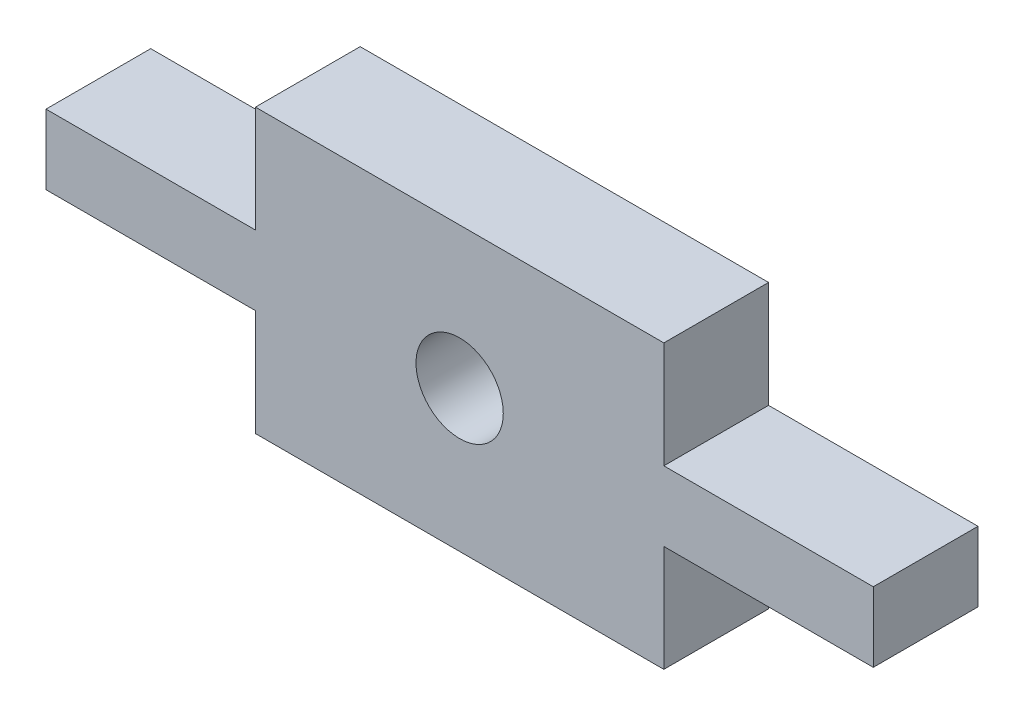
ISO-10303-21;
HEADER;
FILE_DESCRIPTION(('STEP AP214'),'2;1');
FILE_NAME('part.step','',(''),(''),'','','');
FILE_SCHEMA(('AUTOMOTIVE_DESIGN { 1 0 10303 214 1 1 1 1 }'));
ENDSEC;
DATA;
#1=APPLICATION_CONTEXT('core data for automotive mechanical design processes');
#2=APPLICATION_PROTOCOL_DEFINITION('international standard','automotive_design',2000,#1);
#3=PRODUCT_CONTEXT('',#1,'mechanical');
#4=PRODUCT('Part','Part','',(#3));
#5=PRODUCT_RELATED_PRODUCT_CATEGORY('part','',(#4));
#6=PRODUCT_DEFINITION_FORMATION('','',#4);
#7=PRODUCT_DEFINITION_CONTEXT('part definition',#1,'design');
#8=PRODUCT_DEFINITION('design','',#6,#7);
#9=PRODUCT_DEFINITION_SHAPE('','',#8);
#10=(LENGTH_UNIT() NAMED_UNIT(*) SI_UNIT(.MILLI.,.METRE.));
#11=(NAMED_UNIT(*) PLANE_ANGLE_UNIT() SI_UNIT($,.RADIAN.));
#12=(NAMED_UNIT(*) SI_UNIT($,.STERADIAN.) SOLID_ANGLE_UNIT());
#13=UNCERTAINTY_MEASURE_WITH_UNIT(LENGTH_MEASURE(1.E-05),#10,'distance_accuracy_value','');
#14=(GEOMETRIC_REPRESENTATION_CONTEXT(3) GLOBAL_UNCERTAINTY_ASSIGNED_CONTEXT((#13)) GLOBAL_UNIT_ASSIGNED_CONTEXT((#10,
#11,#12)) REPRESENTATION_CONTEXT('',''));
#15=CARTESIAN_POINT('',(0.,0.,0.));
#16=DIRECTION('',(0.,0.,1.));
#17=DIRECTION('',(1.,0.,0.));
#18=AXIS2_PLACEMENT_3D('',#15,#16,#17);
#19=CARTESIAN_POINT('',(0.,3.05,-3.));
#20=DIRECTION('',(-1.,0.,0.));
#21=DIRECTION('',(0.,0.,1.));
#22=AXIS2_PLACEMENT_3D('',#19,#20,#21);
#23=PLANE('',#22);
#24=DIRECTION('',(0.,-1.,0.));
#25=VECTOR('',#24,1.);
#26=CARTESIAN_POINT('',(0.,3.05,0.));
#27=LINE('',#26,#25);
#28=CARTESIAN_POINT('',(0.,3.05,0.));
#29=VERTEX_POINT('',#28);
#30=CARTESIAN_POINT('',(0.,0.,0.));
#31=VERTEX_POINT('',#30);
#32=EDGE_CURVE('E157',#29,#31,#27,.T.);
#33=ORIENTED_EDGE('',*,*,#32,.F.);
#34=DIRECTION('',(0.,0.,1.));
#35=VECTOR('',#34,1.);
#36=CARTESIAN_POINT('',(0.,3.05,-3.));
#37=LINE('',#36,#35);
#38=CARTESIAN_POINT('',(0.,3.05,-3.));
#39=VERTEX_POINT('',#38);
#40=EDGE_CURVE('E11',#39,#29,#37,.T.);
#41=ORIENTED_EDGE('',*,*,#40,.F.);
#42=DIRECTION('',(0.,-1.,0.));
#43=VECTOR('',#42,1.);
#44=CARTESIAN_POINT('',(0.,3.05,-3.));
#45=LINE('',#44,#43);
#46=CARTESIAN_POINT('',(0.,0.,-3.));
#47=VERTEX_POINT('',#46);
#48=EDGE_CURVE('E190',#39,#47,#45,.T.);
#49=ORIENTED_EDGE('',*,*,#48,.T.);
#50=DIRECTION('',(0.,0.,1.));
#51=VECTOR('',#50,1.);
#52=CARTESIAN_POINT('',(0.,0.,-3.));
#53=LINE('',#52,#51);
#54=EDGE_CURVE('E39',#47,#31,#53,.T.);
#55=ORIENTED_EDGE('',*,*,#54,.T.);
#56=EDGE_LOOP('',(#33,#41,#49,#55));
#57=FACE_BOUND('',#56,.T.);
#58=ADVANCED_FACE('F36',(#57),#23,.T.);
#59=CARTESIAN_POINT('',(-6.,3.05,-3.));
#60=DIRECTION('',(0.,-1.,0.));
#61=DIRECTION('',(1.,0.,0.));
#62=AXIS2_PLACEMENT_3D('',#59,#60,#61);
#63=PLANE('',#62);
#64=DIRECTION('',(1.,0.,0.));
#65=VECTOR('',#64,1.);
#66=CARTESIAN_POINT('',(-6.,3.05,0.));
#67=LINE('',#66,#65);
#68=CARTESIAN_POINT('',(-6.,3.05,0.));
#69=VERTEX_POINT('',#68);
#70=EDGE_CURVE('E188',#69,#29,#67,.T.);
#71=ORIENTED_EDGE('',*,*,#70,.F.);
#72=DIRECTION('',(0.,0.,1.));
#73=VECTOR('',#72,1.);
#74=CARTESIAN_POINT('',(-6.,3.05,-3.));
#75=LINE('',#74,#73);
#76=CARTESIAN_POINT('',(-6.,3.05,-3.));
#77=VERTEX_POINT('',#76);
#78=EDGE_CURVE('E45',#77,#69,#75,.T.);
#79=ORIENTED_EDGE('',*,*,#78,.F.);
#80=DIRECTION('',(1.,0.,0.));
#81=VECTOR('',#80,1.);
#82=CARTESIAN_POINT('',(-6.,3.05,-3.));
#83=LINE('',#82,#81);
#84=EDGE_CURVE('E147',#77,#39,#83,.T.);
#85=ORIENTED_EDGE('',*,*,#84,.T.);
#86=ORIENTED_EDGE('',*,*,#40,.T.);
#87=EDGE_LOOP('',(#71,#79,#85,#86));
#88=FACE_BOUND('',#87,.T.);
#89=ADVANCED_FACE('F210',(#88),#63,.T.);
#90=CARTESIAN_POINT('',(-6.,5.05,-3.));
#91=DIRECTION('',(-1.,0.,0.));
#92=DIRECTION('',(0.,0.,1.));
#93=AXIS2_PLACEMENT_3D('',#90,#91,#92);
#94=PLANE('',#93);
#95=DIRECTION('',(0.,-1.,0.));
#96=VECTOR('',#95,1.);
#97=CARTESIAN_POINT('',(-6.,5.05,0.));
#98=LINE('',#97,#96);
#99=CARTESIAN_POINT('',(-6.,5.05,0.));
#100=VERTEX_POINT('',#99);
#101=EDGE_CURVE('E134',#100,#69,#98,.T.);
#102=ORIENTED_EDGE('',*,*,#101,.F.);
#103=DIRECTION('',(0.,0.,1.));
#104=VECTOR('',#103,1.);
#105=CARTESIAN_POINT('',(-6.,5.05,-3.));
#106=LINE('',#105,#104);
#107=CARTESIAN_POINT('',(-6.,5.05,-3.));
#108=VERTEX_POINT('',#107);
#109=EDGE_CURVE('E129',#108,#100,#106,.T.);
#110=ORIENTED_EDGE('',*,*,#109,.F.);
#111=DIRECTION('',(0.,-1.,0.));
#112=VECTOR('',#111,1.);
#113=CARTESIAN_POINT('',(-6.,5.05,-3.));
#114=LINE('',#113,#112);
#115=EDGE_CURVE('E132',#108,#77,#114,.T.);
#116=ORIENTED_EDGE('',*,*,#115,.T.);
#117=ORIENTED_EDGE('',*,*,#78,.T.);
#118=EDGE_LOOP('',(#102,#110,#116,#117));
#119=FACE_BOUND('',#118,.T.);
#120=ADVANCED_FACE('F131',(#119),#94,.T.);
#121=CARTESIAN_POINT('',(0.,5.05,-3.));
#122=DIRECTION('',(0.,1.,0.));
#123=DIRECTION('',(0.,0.,1.));
#124=AXIS2_PLACEMENT_3D('',#121,#122,#123);
#125=PLANE('',#124);
#126=DIRECTION('',(-1.,0.,0.));
#127=VECTOR('',#126,1.);
#128=CARTESIAN_POINT('',(0.,5.05,0.));
#129=LINE('',#128,#127);
#130=CARTESIAN_POINT('',(0.,5.05,0.));
#131=VERTEX_POINT('',#130);
#132=EDGE_CURVE('E185',#131,#100,#129,.T.);
#133=ORIENTED_EDGE('',*,*,#132,.F.);
#134=DIRECTION('',(0.,0.,1.));
#135=VECTOR('',#134,1.);
#136=CARTESIAN_POINT('',(0.,5.05,-3.));
#137=LINE('',#136,#135);
#138=CARTESIAN_POINT('',(0.,5.05,-3.));
#139=VERTEX_POINT('',#138);
#140=EDGE_CURVE('E139',#139,#131,#137,.T.);
#141=ORIENTED_EDGE('',*,*,#140,.F.);
#142=DIRECTION('',(-1.,0.,0.));
#143=VECTOR('',#142,1.);
#144=CARTESIAN_POINT('',(0.,5.05,-3.));
#145=LINE('',#144,#143);
#146=EDGE_CURVE('E145',#139,#108,#145,.T.);
#147=ORIENTED_EDGE('',*,*,#146,.T.);
#148=ORIENTED_EDGE('',*,*,#109,.T.);
#149=EDGE_LOOP('',(#133,#141,#147,#148));
#150=FACE_BOUND('',#149,.T.);
#151=ADVANCED_FACE('F149',(#150),#125,.T.);
#152=CARTESIAN_POINT('',(0.,8.1,-3.));
#153=DIRECTION('',(-1.,0.,0.));
#154=DIRECTION('',(0.,0.,1.));
#155=AXIS2_PLACEMENT_3D('',#152,#153,#154);
#156=PLANE('',#155);
#157=DIRECTION('',(0.,-1.,0.));
#158=VECTOR('',#157,1.);
#159=CARTESIAN_POINT('',(0.,8.1,0.));
#160=LINE('',#159,#158);
#161=CARTESIAN_POINT('',(0.,8.1,0.));
#162=VERTEX_POINT('',#161);
#163=EDGE_CURVE('E182',#162,#131,#160,.T.);
#164=ORIENTED_EDGE('',*,*,#163,.F.);
#165=DIRECTION('',(0.,0.,1.));
#166=VECTOR('',#165,1.);
#167=CARTESIAN_POINT('',(0.,8.1,-3.));
#168=LINE('',#167,#166);
#169=CARTESIAN_POINT('',(0.,8.1,-3.));
#170=VERTEX_POINT('',#169);
#171=EDGE_CURVE('E194',#170,#162,#168,.T.);
#172=ORIENTED_EDGE('',*,*,#171,.F.);
#173=DIRECTION('',(0.,-1.,0.));
#174=VECTOR('',#173,1.);
#175=CARTESIAN_POINT('',(0.,8.1,-3.));
#176=LINE('',#175,#174);
#177=EDGE_CURVE('E150',#170,#139,#176,.T.);
#178=ORIENTED_EDGE('',*,*,#177,.T.);
#179=ORIENTED_EDGE('',*,*,#140,.T.);
#180=EDGE_LOOP('',(#164,#172,#178,#179));
#181=FACE_BOUND('',#180,.T.);
#182=ADVANCED_FACE('F223',(#181),#156,.T.);
#183=CARTESIAN_POINT('',(0.,8.1,-3.));
#184=DIRECTION('',(0.,1.,0.));
#185=DIRECTION('',(0.,0.,1.));
#186=AXIS2_PLACEMENT_3D('',#183,#184,#185);
#187=PLANE('',#186);
#188=DIRECTION('',(-1.,0.,0.));
#189=VECTOR('',#188,1.);
#190=CARTESIAN_POINT('',(0.,8.1,0.));
#191=LINE('',#190,#189);
#192=CARTESIAN_POINT('',(11.7,8.1,0.));
#193=VERTEX_POINT('',#192);
#194=EDGE_CURVE('E179',#193,#162,#191,.T.);
#195=ORIENTED_EDGE('',*,*,#194,.F.);
#196=DIRECTION('',(0.,0.,1.));
#197=VECTOR('',#196,1.);
#198=CARTESIAN_POINT('',(11.7,8.1,-3.));
#199=LINE('',#198,#197);
#200=CARTESIAN_POINT('',(11.7,8.1,-3.));
#201=VERTEX_POINT('',#200);
#202=EDGE_CURVE('E196',#201,#193,#199,.T.);
#203=ORIENTED_EDGE('',*,*,#202,.F.);
#204=DIRECTION('',(-1.,0.,0.));
#205=VECTOR('',#204,1.);
#206=CARTESIAN_POINT('',(0.,8.1,-3.));
#207=LINE('',#206,#205);
#208=EDGE_CURVE('E152',#201,#170,#207,.T.);
#209=ORIENTED_EDGE('',*,*,#208,.T.);
#210=ORIENTED_EDGE('',*,*,#171,.T.);
#211=EDGE_LOOP('',(#195,#203,#209,#210));
#212=FACE_BOUND('',#211,.T.);
#213=ADVANCED_FACE('F226',(#212),#187,.T.);
#214=CARTESIAN_POINT('',(11.7,5.05,-3.));
#215=DIRECTION('',(1.,0.,0.));
#216=DIRECTION('',(0.,0.,-1.));
#217=AXIS2_PLACEMENT_3D('',#214,#215,#216);
#218=PLANE('',#217);
#219=DIRECTION('',(0.,1.,0.));
#220=VECTOR('',#219,1.);
#221=CARTESIAN_POINT('',(11.7,5.05,0.));
#222=LINE('',#221,#220);
#223=CARTESIAN_POINT('',(11.7,5.05,0.));
#224=VERTEX_POINT('',#223);
#225=EDGE_CURVE('E176',#224,#193,#222,.T.);
#226=ORIENTED_EDGE('',*,*,#225,.F.);
#227=DIRECTION('',(0.,0.,1.));
#228=VECTOR('',#227,1.);
#229=CARTESIAN_POINT('',(11.7,5.05,-3.));
#230=LINE('',#229,#228);
#231=CARTESIAN_POINT('',(11.7,5.05,-3.));
#232=VERTEX_POINT('',#231);
#233=EDGE_CURVE('E198',#232,#224,#230,.T.);
#234=ORIENTED_EDGE('',*,*,#233,.F.);
#235=DIRECTION('',(0.,1.,0.));
#236=VECTOR('',#235,1.);
#237=CARTESIAN_POINT('',(11.7,5.05,-3.));
#238=LINE('',#237,#236);
#239=EDGE_CURVE('E289',#232,#201,#238,.T.);
#240=ORIENTED_EDGE('',*,*,#239,.T.);
#241=ORIENTED_EDGE('',*,*,#202,.T.);
#242=EDGE_LOOP('',(#226,#234,#240,#241));
#243=FACE_BOUND('',#242,.T.);
#244=ADVANCED_FACE('F230',(#243),#218,.T.);
#245=CARTESIAN_POINT('',(11.7,5.05,-3.));
#246=DIRECTION('',(0.,1.,0.));
#247=DIRECTION('',(0.,0.,1.));
#248=AXIS2_PLACEMENT_3D('',#245,#246,#247);
#249=PLANE('',#248);
#250=DIRECTION('',(-1.,0.,0.));
#251=VECTOR('',#250,1.);
#252=CARTESIAN_POINT('',(11.7,5.05,0.));
#253=LINE('',#252,#251);
#254=CARTESIAN_POINT('',(17.7,5.05,0.));
#255=VERTEX_POINT('',#254);
#256=EDGE_CURVE('E173',#255,#224,#253,.T.);
#257=ORIENTED_EDGE('',*,*,#256,.F.);
#258=DIRECTION('',(0.,0.,1.));
#259=VECTOR('',#258,1.);
#260=CARTESIAN_POINT('',(17.7,5.05,-3.));
#261=LINE('',#260,#259);
#262=CARTESIAN_POINT('',(17.7,5.05,-3.));
#263=VERTEX_POINT('',#262);
#264=EDGE_CURVE('E200',#263,#255,#261,.T.);
#265=ORIENTED_EDGE('',*,*,#264,.F.);
#266=DIRECTION('',(-1.,0.,0.));
#267=VECTOR('',#266,1.);
#268=CARTESIAN_POINT('',(11.7,5.05,-3.));
#269=LINE('',#268,#267);
#270=EDGE_CURVE('E286',#263,#232,#269,.T.);
#271=ORIENTED_EDGE('',*,*,#270,.T.);
#272=ORIENTED_EDGE('',*,*,#233,.T.);
#273=EDGE_LOOP('',(#257,#265,#271,#272));
#274=FACE_BOUND('',#273,.T.);
#275=ADVANCED_FACE('F234',(#274),#249,.T.);
#276=CARTESIAN_POINT('',(17.7,5.05,-3.));
#277=DIRECTION('',(1.,0.,0.));
#278=DIRECTION('',(0.,0.,-1.));
#279=AXIS2_PLACEMENT_3D('',#276,#277,#278);
#280=PLANE('',#279);
#281=DIRECTION('',(0.,1.,0.));
#282=VECTOR('',#281,1.);
#283=CARTESIAN_POINT('',(17.7,5.05,0.));
#284=LINE('',#283,#282);
#285=CARTESIAN_POINT('',(17.7,3.05,0.));
#286=VERTEX_POINT('',#285);
#287=EDGE_CURVE('E170',#286,#255,#284,.T.);
#288=ORIENTED_EDGE('',*,*,#287,.F.);
#289=DIRECTION('',(0.,0.,1.));
#290=VECTOR('',#289,1.);
#291=CARTESIAN_POINT('',(17.7,3.05,-3.));
#292=LINE('',#291,#290);
#293=CARTESIAN_POINT('',(17.7,3.05,-3.));
#294=VERTEX_POINT('',#293);
#295=EDGE_CURVE('E202',#294,#286,#292,.T.);
#296=ORIENTED_EDGE('',*,*,#295,.F.);
#297=DIRECTION('',(0.,1.,0.));
#298=VECTOR('',#297,1.);
#299=CARTESIAN_POINT('',(17.7,5.05,-3.));
#300=LINE('',#299,#298);
#301=EDGE_CURVE('E283',#294,#263,#300,.T.);
#302=ORIENTED_EDGE('',*,*,#301,.T.);
#303=ORIENTED_EDGE('',*,*,#264,.T.);
#304=EDGE_LOOP('',(#288,#296,#302,#303));
#305=FACE_BOUND('',#304,.T.);
#306=ADVANCED_FACE('F238',(#305),#280,.T.);
#307=CARTESIAN_POINT('',(17.7,3.05,-3.));
#308=DIRECTION('',(0.,-1.,0.));
#309=DIRECTION('',(1.,0.,0.));
#310=AXIS2_PLACEMENT_3D('',#307,#308,#309);
#311=PLANE('',#310);
#312=DIRECTION('',(1.,0.,0.));
#313=VECTOR('',#312,1.);
#314=CARTESIAN_POINT('',(17.7,3.05,0.));
#315=LINE('',#314,#313);
#316=CARTESIAN_POINT('',(11.7,3.05,0.));
#317=VERTEX_POINT('',#316);
#318=EDGE_CURVE('E167',#317,#286,#315,.T.);
#319=ORIENTED_EDGE('',*,*,#318,.F.);
#320=DIRECTION('',(0.,0.,1.));
#321=VECTOR('',#320,1.);
#322=CARTESIAN_POINT('',(11.7,3.05,-3.));
#323=LINE('',#322,#321);
#324=CARTESIAN_POINT('',(11.7,3.05,-3.));
#325=VERTEX_POINT('',#324);
#326=EDGE_CURVE('E204',#325,#317,#323,.T.);
#327=ORIENTED_EDGE('',*,*,#326,.F.);
#328=DIRECTION('',(1.,0.,0.));
#329=VECTOR('',#328,1.);
#330=CARTESIAN_POINT('',(17.7,3.05,-3.));
#331=LINE('',#330,#329);
#332=EDGE_CURVE('E280',#325,#294,#331,.T.);
#333=ORIENTED_EDGE('',*,*,#332,.T.);
#334=ORIENTED_EDGE('',*,*,#295,.T.);
#335=EDGE_LOOP('',(#319,#327,#333,#334));
#336=FACE_BOUND('',#335,.T.);
#337=ADVANCED_FACE('F242',(#336),#311,.T.);
#338=CARTESIAN_POINT('',(11.7,0.,-3.));
#339=DIRECTION('',(1.,0.,0.));
#340=DIRECTION('',(0.,0.,-1.));
#341=AXIS2_PLACEMENT_3D('',#338,#339,#340);
#342=PLANE('',#341);
#343=DIRECTION('',(0.,1.,0.));
#344=VECTOR('',#343,1.);
#345=CARTESIAN_POINT('',(11.7,0.,0.));
#346=LINE('',#345,#344);
#347=CARTESIAN_POINT('',(11.7,0.,0.));
#348=VERTEX_POINT('',#347);
#349=EDGE_CURVE('E164',#348,#317,#346,.T.);
#350=ORIENTED_EDGE('',*,*,#349,.F.);
#351=DIRECTION('',(0.,0.,1.));
#352=VECTOR('',#351,1.);
#353=CARTESIAN_POINT('',(11.7,0.,-3.));
#354=LINE('',#353,#352);
#355=CARTESIAN_POINT('',(11.7,0.,-3.));
#356=VERTEX_POINT('',#355);
#357=EDGE_CURVE('E205',#356,#348,#354,.T.);
#358=ORIENTED_EDGE('',*,*,#357,.F.);
#359=DIRECTION('',(0.,1.,0.));
#360=VECTOR('',#359,1.);
#361=CARTESIAN_POINT('',(11.7,0.,-3.));
#362=LINE('',#361,#360);
#363=EDGE_CURVE('E277',#356,#325,#362,.T.);
#364=ORIENTED_EDGE('',*,*,#363,.T.);
#365=ORIENTED_EDGE('',*,*,#326,.T.);
#366=EDGE_LOOP('',(#350,#358,#364,#365));
#367=FACE_BOUND('',#366,.T.);
#368=ADVANCED_FACE('F246',(#367),#342,.T.);
#369=CARTESIAN_POINT('',(0.,0.,-3.));
#370=DIRECTION('',(0.,-1.,0.));
#371=DIRECTION('',(0.,0.,-1.));
#372=AXIS2_PLACEMENT_3D('',#369,#370,#371);
#373=PLANE('',#372);
#374=DIRECTION('',(1.,0.,0.));
#375=VECTOR('',#374,1.);
#376=CARTESIAN_POINT('',(0.,0.,0.));
#377=LINE('',#376,#375);
#378=EDGE_CURVE('E160',#31,#348,#377,.T.);
#379=ORIENTED_EDGE('',*,*,#378,.F.);
#380=ORIENTED_EDGE('',*,*,#54,.F.);
#381=DIRECTION('',(1.,0.,0.));
#382=VECTOR('',#381,1.);
#383=CARTESIAN_POINT('',(0.,0.,-3.));
#384=LINE('',#383,#382);
#385=EDGE_CURVE('E275',#47,#356,#384,.T.);
#386=ORIENTED_EDGE('',*,*,#385,.T.);
#387=ORIENTED_EDGE('',*,*,#357,.T.);
#388=EDGE_LOOP('',(#379,#380,#386,#387));
#389=FACE_BOUND('',#388,.T.);
#390=ADVANCED_FACE('F207',(#389),#373,.T.);
#391=CARTESIAN_POINT('',(0.,0.,-3.));
#392=DIRECTION('',(0.,0.,1.));
#393=DIRECTION('',(1.,0.,0.));
#394=AXIS2_PLACEMENT_3D('',#391,#392,#393);
#395=PLANE('',#394);
#396=CARTESIAN_POINT('',(5.85,4.05,-3.));
#397=DIRECTION('',(0.,0.,1.));
#398=DIRECTION('',(1.,0.,0.));
#399=AXIS2_PLACEMENT_3D('',#396,#397,#398);
#400=CIRCLE('',#399,1.25);
#401=CARTESIAN_POINT('',(7.1,4.05,-3.));
#402=VERTEX_POINT('',#401);
#403=EDGE_CURVE('E161',#402,#402,#400,.T.);
#404=ORIENTED_EDGE('',*,*,#403,.T.);
#405=EDGE_LOOP('',(#404));
#406=FACE_BOUND('',#405,.T.);
#407=ORIENTED_EDGE('',*,*,#48,.F.);
#408=ORIENTED_EDGE('',*,*,#84,.F.);
#409=ORIENTED_EDGE('',*,*,#115,.F.);
#410=ORIENTED_EDGE('',*,*,#146,.F.);
#411=ORIENTED_EDGE('',*,*,#177,.F.);
#412=ORIENTED_EDGE('',*,*,#208,.F.);
#413=ORIENTED_EDGE('',*,*,#239,.F.);
#414=ORIENTED_EDGE('',*,*,#270,.F.);
#415=ORIENTED_EDGE('',*,*,#301,.F.);
#416=ORIENTED_EDGE('',*,*,#332,.F.);
#417=ORIENTED_EDGE('',*,*,#363,.F.);
#418=ORIENTED_EDGE('',*,*,#385,.F.);
#419=EDGE_LOOP('',(#407,#408,#409,#410,#411,#412,#413,#414,#415,#416,#417,#418));
#420=FACE_BOUND('',#419,.T.);
#421=ADVANCED_FACE('F143',(#406,#420),#395,.F.);
#422=CARTESIAN_POINT('',(0.,0.,0.));
#423=DIRECTION('',(0.,0.,1.));
#424=DIRECTION('',(1.,0.,0.));
#425=AXIS2_PLACEMENT_3D('',#422,#423,#424);
#426=PLANE('',#425);
#427=CARTESIAN_POINT('',(5.85,4.05,0.));
#428=DIRECTION('',(0.,0.,1.));
#429=DIRECTION('',(1.,0.,0.));
#430=AXIS2_PLACEMENT_3D('',#427,#428,#429);
#431=CIRCLE('',#430,1.25);
#432=CARTESIAN_POINT('',(7.1,4.05,0.));
#433=VERTEX_POINT('',#432);
#434=EDGE_CURVE('E270',#433,#433,#431,.T.);
#435=ORIENTED_EDGE('',*,*,#434,.F.);
#436=EDGE_LOOP('',(#435));
#437=FACE_BOUND('',#436,.T.);
#438=ORIENTED_EDGE('',*,*,#32,.T.);
#439=ORIENTED_EDGE('',*,*,#378,.T.);
#440=ORIENTED_EDGE('',*,*,#349,.T.);
#441=ORIENTED_EDGE('',*,*,#318,.T.);
#442=ORIENTED_EDGE('',*,*,#287,.T.);
#443=ORIENTED_EDGE('',*,*,#256,.T.);
#444=ORIENTED_EDGE('',*,*,#225,.T.);
#445=ORIENTED_EDGE('',*,*,#194,.T.);
#446=ORIENTED_EDGE('',*,*,#163,.T.);
#447=ORIENTED_EDGE('',*,*,#132,.T.);
#448=ORIENTED_EDGE('',*,*,#101,.T.);
#449=ORIENTED_EDGE('',*,*,#70,.T.);
#450=EDGE_LOOP('',(#438,#439,#440,#441,#442,#443,#444,#445,#446,#447,#448,#449));
#451=FACE_BOUND('',#450,.T.);
#452=ADVANCED_FACE('F209',(#437,#451),#426,.T.);
#453=CARTESIAN_POINT('',(5.85,4.05,-3.));
#454=DIRECTION('',(0.,0.,1.));
#455=DIRECTION('',(1.,0.,0.));
#456=AXIS2_PLACEMENT_3D('',#453,#454,#455);
#457=CYLINDRICAL_SURFACE('',#456,1.25);
#458=ORIENTED_EDGE('',*,*,#403,.F.);
#459=EDGE_LOOP('',(#458));
#460=FACE_BOUND('',#459,.T.);
#461=ORIENTED_EDGE('',*,*,#434,.T.);
#462=EDGE_LOOP('',(#461));
#463=FACE_BOUND('',#462,.T.);
#464=ADVANCED_FACE('F258',(#460,#463),#457,.F.);
#465=CLOSED_SHELL('',(#58,#89,#120,#151,#182,#213,#244,#275,#306,#337,#368,#390,#421,#452,#464));
#466=MANIFOLD_SOLID_BREP('B2',#465);
#467=ADVANCED_BREP_SHAPE_REPRESENTATION('',(#18,#466),#14);
#468=SHAPE_DEFINITION_REPRESENTATION(#9,#467);
ENDSEC;
END-ISO-10303-21;
